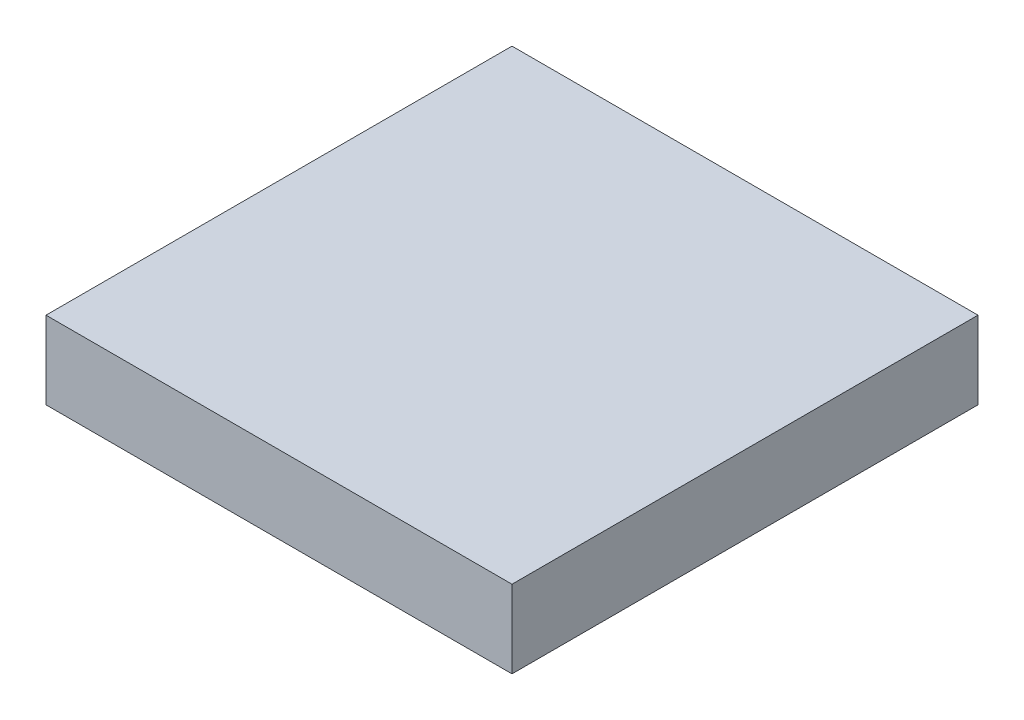
ISO-10303-21;
HEADER;
FILE_DESCRIPTION(('STEP AP214'),'2;1');
FILE_NAME('part.step','',(''),(''),'','','');
FILE_SCHEMA(('AUTOMOTIVE_DESIGN { 1 0 10303 214 1 1 1 1 }'));
ENDSEC;
DATA;
#1=APPLICATION_CONTEXT('core data for automotive mechanical design processes');
#2=APPLICATION_PROTOCOL_DEFINITION('international standard','automotive_design',2000,#1);
#3=PRODUCT_CONTEXT('',#1,'mechanical');
#4=PRODUCT('Part','Part','',(#3));
#5=PRODUCT_RELATED_PRODUCT_CATEGORY('part','',(#4));
#6=PRODUCT_DEFINITION_FORMATION('','',#4);
#7=PRODUCT_DEFINITION_CONTEXT('part definition',#1,'design');
#8=PRODUCT_DEFINITION('design','',#6,#7);
#9=PRODUCT_DEFINITION_SHAPE('','',#8);
#10=(LENGTH_UNIT() NAMED_UNIT(*) SI_UNIT(.MILLI.,.METRE.));
#11=(NAMED_UNIT(*) PLANE_ANGLE_UNIT() SI_UNIT($,.RADIAN.));
#12=(NAMED_UNIT(*) SI_UNIT($,.STERADIAN.) SOLID_ANGLE_UNIT());
#13=UNCERTAINTY_MEASURE_WITH_UNIT(LENGTH_MEASURE(1.E-05),#10,'distance_accuracy_value','');
#14=(GEOMETRIC_REPRESENTATION_CONTEXT(3) GLOBAL_UNCERTAINTY_ASSIGNED_CONTEXT((#13)) GLOBAL_UNIT_ASSIGNED_CONTEXT((#10,
#11,#12)) REPRESENTATION_CONTEXT('',''));
#15=CARTESIAN_POINT('',(0.,0.,0.));
#16=DIRECTION('',(0.,0.,1.));
#17=DIRECTION('',(1.,0.,0.));
#18=AXIS2_PLACEMENT_3D('',#15,#16,#17);
#19=CARTESIAN_POINT('',(-300.,100.,300.));
#20=DIRECTION('',(1.,0.,0.));
#21=DIRECTION('',(0.,0.,-1.));
#22=AXIS2_PLACEMENT_3D('',#19,#20,#21);
#23=PLANE('',#22);
#24=DIRECTION('',(0.,0.,1.));
#25=VECTOR('',#24,1.);
#26=CARTESIAN_POINT('',(-300.,0.,300.));
#27=LINE('',#26,#25);
#28=CARTESIAN_POINT('',(-300.,0.,-300.));
#29=VERTEX_POINT('',#28);
#30=CARTESIAN_POINT('',(-300.,0.,300.));
#31=VERTEX_POINT('',#30);
#32=EDGE_CURVE('E96',#29,#31,#27,.T.);
#33=ORIENTED_EDGE('',*,*,#32,.T.);
#34=DIRECTION('',(0.,-1.,0.));
#35=VECTOR('',#34,1.);
#36=CARTESIAN_POINT('',(-300.,100.,300.));
#37=LINE('',#36,#35);
#38=CARTESIAN_POINT('',(-300.,100.,300.));
#39=VERTEX_POINT('',#38);
#40=EDGE_CURVE('E11',#39,#31,#37,.T.);
#41=ORIENTED_EDGE('',*,*,#40,.F.);
#42=DIRECTION('',(0.,0.,1.));
#43=VECTOR('',#42,1.);
#44=CARTESIAN_POINT('',(-300.,100.,300.));
#45=LINE('',#44,#43);
#46=CARTESIAN_POINT('',(-300.,100.,-300.));
#47=VERTEX_POINT('',#46);
#48=EDGE_CURVE('E84',#47,#39,#45,.T.);
#49=ORIENTED_EDGE('',*,*,#48,.F.);
#50=DIRECTION('',(0.,-1.,0.));
#51=VECTOR('',#50,1.);
#52=CARTESIAN_POINT('',(-300.,100.,-300.));
#53=LINE('',#52,#51);
#54=EDGE_CURVE('E92',#47,#29,#53,.T.);
#55=ORIENTED_EDGE('',*,*,#54,.T.);
#56=EDGE_LOOP('',(#33,#41,#49,#55));
#57=FACE_BOUND('',#56,.T.);
#58=ADVANCED_FACE('F33',(#57),#23,.F.);
#59=CARTESIAN_POINT('',(300.,100.,300.));
#60=DIRECTION('',(0.,0.,-1.));
#61=DIRECTION('',(-1.,0.,0.));
#62=AXIS2_PLACEMENT_3D('',#59,#60,#61);
#63=PLANE('',#62);
#64=DIRECTION('',(1.,0.,0.));
#65=VECTOR('',#64,1.);
#66=CARTESIAN_POINT('',(300.,0.,300.));
#67=LINE('',#66,#65);
#68=CARTESIAN_POINT('',(300.,0.,300.));
#69=VERTEX_POINT('',#68);
#70=EDGE_CURVE('E88',#31,#69,#67,.T.);
#71=ORIENTED_EDGE('',*,*,#70,.T.);
#72=DIRECTION('',(0.,-1.,0.));
#73=VECTOR('',#72,1.);
#74=CARTESIAN_POINT('',(300.,100.,300.));
#75=LINE('',#74,#73);
#76=CARTESIAN_POINT('',(300.,100.,300.));
#77=VERTEX_POINT('',#76);
#78=EDGE_CURVE('E41',#77,#69,#75,.T.);
#79=ORIENTED_EDGE('',*,*,#78,.F.);
#80=DIRECTION('',(1.,0.,0.));
#81=VECTOR('',#80,1.);
#82=CARTESIAN_POINT('',(300.,100.,300.));
#83=LINE('',#82,#81);
#84=EDGE_CURVE('E79',#39,#77,#83,.T.);
#85=ORIENTED_EDGE('',*,*,#84,.F.);
#86=ORIENTED_EDGE('',*,*,#40,.T.);
#87=EDGE_LOOP('',(#71,#79,#85,#86));
#88=FACE_BOUND('',#87,.T.);
#89=ADVANCED_FACE('F87',(#88),#63,.F.);
#90=CARTESIAN_POINT('',(300.,100.,300.));
#91=DIRECTION('',(-1.,0.,0.));
#92=DIRECTION('',(0.,0.,1.));
#93=AXIS2_PLACEMENT_3D('',#90,#91,#92);
#94=PLANE('',#93);
#95=DIRECTION('',(0.,0.,-1.));
#96=VECTOR('',#95,1.);
#97=CARTESIAN_POINT('',(300.,0.,300.));
#98=LINE('',#97,#96);
#99=CARTESIAN_POINT('',(300.,0.,-300.));
#100=VERTEX_POINT('',#99);
#101=EDGE_CURVE('E66',#69,#100,#98,.T.);
#102=ORIENTED_EDGE('',*,*,#101,.T.);
#103=DIRECTION('',(0.,-1.,0.));
#104=VECTOR('',#103,1.);
#105=CARTESIAN_POINT('',(300.,100.,-300.));
#106=LINE('',#105,#104);
#107=CARTESIAN_POINT('',(300.,100.,-300.));
#108=VERTEX_POINT('',#107);
#109=EDGE_CURVE('E89',#108,#100,#106,.T.);
#110=ORIENTED_EDGE('',*,*,#109,.F.);
#111=DIRECTION('',(0.,0.,-1.));
#112=VECTOR('',#111,1.);
#113=CARTESIAN_POINT('',(300.,100.,300.));
#114=LINE('',#113,#112);
#115=EDGE_CURVE('E82',#77,#108,#114,.T.);
#116=ORIENTED_EDGE('',*,*,#115,.F.);
#117=ORIENTED_EDGE('',*,*,#78,.T.);
#118=EDGE_LOOP('',(#102,#110,#116,#117));
#119=FACE_BOUND('',#118,.T.);
#120=ADVANCED_FACE('F90',(#119),#94,.F.);
#121=CARTESIAN_POINT('',(300.,100.,-300.));
#122=DIRECTION('',(0.,0.,1.));
#123=DIRECTION('',(1.,0.,0.));
#124=AXIS2_PLACEMENT_3D('',#121,#122,#123);
#125=PLANE('',#124);
#126=DIRECTION('',(-1.,0.,0.));
#127=VECTOR('',#126,1.);
#128=CARTESIAN_POINT('',(300.,0.,-300.));
#129=LINE('',#128,#127);
#130=EDGE_CURVE('E72',#100,#29,#129,.T.);
#131=ORIENTED_EDGE('',*,*,#130,.T.);
#132=ORIENTED_EDGE('',*,*,#54,.F.);
#133=DIRECTION('',(-1.,0.,0.));
#134=VECTOR('',#133,1.);
#135=CARTESIAN_POINT('',(300.,100.,-300.));
#136=LINE('',#135,#134);
#137=EDGE_CURVE('E49',#108,#47,#136,.T.);
#138=ORIENTED_EDGE('',*,*,#137,.F.);
#139=ORIENTED_EDGE('',*,*,#109,.T.);
#140=EDGE_LOOP('',(#131,#132,#138,#139));
#141=FACE_BOUND('',#140,.T.);
#142=ADVANCED_FACE('F103',(#141),#125,.F.);
#143=CARTESIAN_POINT('',(0.,100.,0.));
#144=DIRECTION('',(0.,1.,0.));
#145=DIRECTION('',(0.,0.,1.));
#146=AXIS2_PLACEMENT_3D('',#143,#144,#145);
#147=PLANE('',#146);
#148=ORIENTED_EDGE('',*,*,#48,.T.);
#149=ORIENTED_EDGE('',*,*,#84,.T.);
#150=ORIENTED_EDGE('',*,*,#115,.T.);
#151=ORIENTED_EDGE('',*,*,#137,.T.);
#152=EDGE_LOOP('',(#148,#149,#150,#151));
#153=FACE_BOUND('',#152,.T.);
#154=ADVANCED_FACE('F80',(#153),#147,.T.);
#155=CARTESIAN_POINT('',(0.,0.,0.));
#156=DIRECTION('',(0.,1.,0.));
#157=DIRECTION('',(0.,0.,1.));
#158=AXIS2_PLACEMENT_3D('',#155,#156,#157);
#159=PLANE('',#158);
#160=ORIENTED_EDGE('',*,*,#32,.F.);
#161=ORIENTED_EDGE('',*,*,#130,.F.);
#162=ORIENTED_EDGE('',*,*,#101,.F.);
#163=ORIENTED_EDGE('',*,*,#70,.F.);
#164=EDGE_LOOP('',(#160,#161,#162,#163));
#165=FACE_BOUND('',#164,.T.);
#166=ADVANCED_FACE('F106',(#165),#159,.F.);
#167=CLOSED_SHELL('',(#58,#89,#120,#142,#154,#166));
#168=MANIFOLD_SOLID_BREP('B2',#167);
#169=ADVANCED_BREP_SHAPE_REPRESENTATION('',(#18,#168),#14);
#170=SHAPE_DEFINITION_REPRESENTATION(#9,#169);
ENDSEC;
END-ISO-10303-21;
